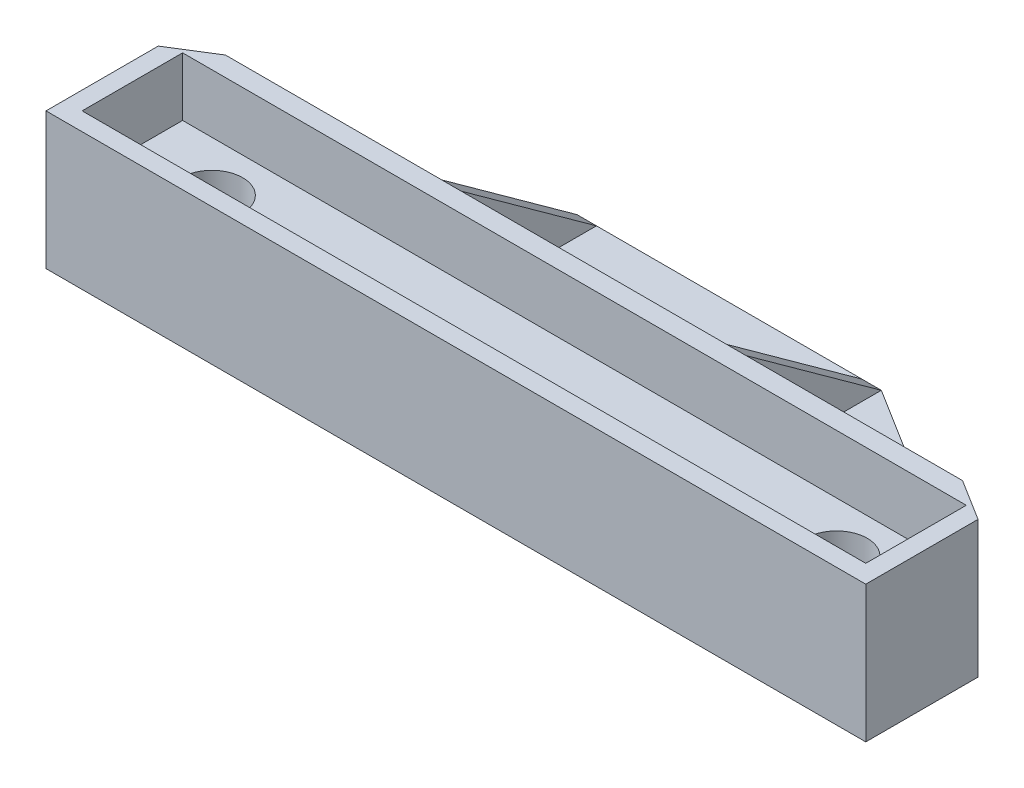
ISO-10303-21;
HEADER;
FILE_DESCRIPTION(('STEP AP214'),'2;1');
FILE_NAME('part.step','',(''),(''),'','','');
FILE_SCHEMA(('AUTOMOTIVE_DESIGN { 1 0 10303 214 1 1 1 1 }'));
ENDSEC;
DATA;
#1=APPLICATION_CONTEXT('core data for automotive mechanical design processes');
#2=APPLICATION_PROTOCOL_DEFINITION('international standard','automotive_design',2000,#1);
#3=PRODUCT_CONTEXT('',#1,'mechanical');
#4=PRODUCT('Part','Part','',(#3));
#5=PRODUCT_RELATED_PRODUCT_CATEGORY('part','',(#4));
#6=PRODUCT_DEFINITION_FORMATION('','',#4);
#7=PRODUCT_DEFINITION_CONTEXT('part definition',#1,'design');
#8=PRODUCT_DEFINITION('design','',#6,#7);
#9=PRODUCT_DEFINITION_SHAPE('','',#8);
#10=(LENGTH_UNIT() NAMED_UNIT(*) SI_UNIT(.MILLI.,.METRE.));
#11=(NAMED_UNIT(*) PLANE_ANGLE_UNIT() SI_UNIT($,.RADIAN.));
#12=(NAMED_UNIT(*) SI_UNIT($,.STERADIAN.) SOLID_ANGLE_UNIT());
#13=UNCERTAINTY_MEASURE_WITH_UNIT(LENGTH_MEASURE(1.E-05),#10,'distance_accuracy_value','');
#14=(GEOMETRIC_REPRESENTATION_CONTEXT(3) GLOBAL_UNCERTAINTY_ASSIGNED_CONTEXT((#13)) GLOBAL_UNIT_ASSIGNED_CONTEXT((#10,
#11,#12)) REPRESENTATION_CONTEXT('',''));
#15=CARTESIAN_POINT('',(0.,0.,0.));
#16=DIRECTION('',(0.,0.,1.));
#17=DIRECTION('',(1.,0.,0.));
#18=AXIS2_PLACEMENT_3D('',#15,#16,#17);
#19=CARTESIAN_POINT('',(-16.,7.,-3.49999999993634));
#20=DIRECTION('',(0.,-1.,0.));
#21=DIRECTION('',(0.,0.,-1.));
#22=AXIS2_PLACEMENT_3D('',#19,#20,#21);
#23=CYLINDRICAL_SURFACE('',#22,1.575);
#24=CARTESIAN_POINT('',(-16.,0.,-3.49999999993634));
#25=DIRECTION('',(0.,-1.,0.));
#26=DIRECTION('',(0.,0.,1.));
#27=AXIS2_PLACEMENT_3D('',#24,#25,#26);
#28=CIRCLE('',#27,1.575);
#29=CARTESIAN_POINT('',(-16.,0.,-1.92499999993634));
#30=VERTEX_POINT('',#29);
#31=EDGE_CURVE('E268',#30,#30,#28,.T.);
#32=ORIENTED_EDGE('',*,*,#31,.T.);
#33=EDGE_LOOP('',(#32));
#34=FACE_BOUND('',#33,.T.);
#35=CARTESIAN_POINT('',(-16.,4.,-3.49999999993634));
#36=DIRECTION('',(0.,1.,0.));
#37=DIRECTION('',(0.,0.,1.));
#38=AXIS2_PLACEMENT_3D('',#35,#36,#37);
#39=CIRCLE('',#38,1.575);
#40=CARTESIAN_POINT('',(-16.,4.,-1.92499999993634));
#41=VERTEX_POINT('',#40);
#42=EDGE_CURVE('E265',#41,#41,#39,.F.);
#43=ORIENTED_EDGE('',*,*,#42,.F.);
#44=EDGE_LOOP('',(#43));
#45=FACE_BOUND('',#44,.T.);
#46=ADVANCED_FACE('F40',(#34,#45),#23,.F.);
#47=CARTESIAN_POINT('',(16.,7.,-3.49999999993633));
#48=DIRECTION('',(0.,-1.,0.));
#49=DIRECTION('',(0.,0.,-1.));
#50=AXIS2_PLACEMENT_3D('',#47,#48,#49);
#51=CYLINDRICAL_SURFACE('',#50,1.575);
#52=CARTESIAN_POINT('',(16.,0.,-3.49999999993633));
#53=DIRECTION('',(0.,-1.,0.));
#54=DIRECTION('',(0.,0.,-1.));
#55=AXIS2_PLACEMENT_3D('',#52,#53,#54);
#56=CIRCLE('',#55,1.575);
#57=CARTESIAN_POINT('',(16.,0.,-5.07499999993633));
#58=VERTEX_POINT('',#57);
#59=EDGE_CURVE('E269',#58,#58,#56,.T.);
#60=ORIENTED_EDGE('',*,*,#59,.T.);
#61=EDGE_LOOP('',(#60));
#62=FACE_BOUND('',#61,.T.);
#63=CARTESIAN_POINT('',(16.,4.,-3.49999999993633));
#64=DIRECTION('',(0.,1.,0.));
#65=DIRECTION('',(0.,0.,1.));
#66=AXIS2_PLACEMENT_3D('',#63,#64,#65);
#67=CIRCLE('',#66,1.575);
#68=CARTESIAN_POINT('',(16.,4.,-1.92499999993633));
#69=VERTEX_POINT('',#68);
#70=EDGE_CURVE('E258',#69,#69,#67,.F.);
#71=ORIENTED_EDGE('',*,*,#70,.F.);
#72=EDGE_LOOP('',(#71));
#73=FACE_BOUND('',#72,.T.);
#74=ADVANCED_FACE('F349',(#62,#73),#51,.F.);
#75=CARTESIAN_POINT('',(21.,7.,-5.75));
#76=DIRECTION('',(-1.,0.,0.));
#77=DIRECTION('',(0.,0.,1.));
#78=AXIS2_PLACEMENT_3D('',#75,#76,#77);
#79=PLANE('',#78);
#80=DIRECTION('',(0.,0.,-1.));
#81=VECTOR('',#80,1.);
#82=CARTESIAN_POINT('',(21.,0.,-5.75));
#83=LINE('',#82,#81);
#84=CARTESIAN_POINT('',(21.,0.,0.));
#85=VERTEX_POINT('',#84);
#86=CARTESIAN_POINT('',(21.,0.,-5.75));
#87=VERTEX_POINT('',#86);
#88=EDGE_CURVE('E272',#85,#87,#83,.T.);
#89=ORIENTED_EDGE('',*,*,#88,.T.);
#90=DIRECTION('',(0.,-1.,0.));
#91=VECTOR('',#90,1.);
#92=CARTESIAN_POINT('',(21.,7.,-5.75));
#93=LINE('',#92,#91);
#94=CARTESIAN_POINT('',(21.,7.,-5.75));
#95=VERTEX_POINT('',#94);
#96=EDGE_CURVE('E305',#95,#87,#93,.T.);
#97=ORIENTED_EDGE('',*,*,#96,.F.);
#98=DIRECTION('',(0.,0.,-1.));
#99=VECTOR('',#98,1.);
#100=CARTESIAN_POINT('',(21.,7.,-5.75));
#101=LINE('',#100,#99);
#102=CARTESIAN_POINT('',(21.,7.,0.));
#103=VERTEX_POINT('',#102);
#104=EDGE_CURVE('E275',#103,#95,#101,.T.);
#105=ORIENTED_EDGE('',*,*,#104,.F.);
#106=DIRECTION('',(0.,-1.,0.));
#107=VECTOR('',#106,1.);
#108=CARTESIAN_POINT('',(21.,7.,0.));
#109=LINE('',#108,#107);
#110=EDGE_CURVE('E288',#103,#85,#109,.T.);
#111=ORIENTED_EDGE('',*,*,#110,.T.);
#112=EDGE_LOOP('',(#89,#97,#105,#111));
#113=FACE_BOUND('',#112,.T.);
#114=ADVANCED_FACE('F355',(#113),#79,.F.);
#115=CARTESIAN_POINT('',(21.,7.,-5.75));
#116=DIRECTION('',(-0.529919264233528,0.,0.848048096156224));
#117=DIRECTION('',(0.848048096156224,0.,0.529919264233528));
#118=AXIS2_PLACEMENT_3D('',#115,#116,#117);
#119=PLANE('',#118);
#120=DIRECTION('',(-0.848048096156395,0.,-0.529919264233254));
#121=VECTOR('',#120,1.);
#122=CARTESIAN_POINT('',(7.79724013561682,2.,-13.9999999998727));
#123=LINE('',#122,#121);
#124=CARTESIAN_POINT('',(17.2792222201838,2.,-8.07499999987266));
#125=VERTEX_POINT('',#124);
#126=CARTESIAN_POINT('',(7.79724013561682,2.,-13.9999999998727));
#127=VERTEX_POINT('',#126);
#128=EDGE_CURVE('E178',#125,#127,#123,.T.);
#129=ORIENTED_EDGE('',*,*,#128,.F.);
#130=DIRECTION('',(-0.749337346632538,-0.468237942152119,-0.468237942152125));
#131=VECTOR('',#130,1.);
#132=CARTESIAN_POINT('',(21.9385723739609,4.91148511091008,-5.16351488896254));
#133=LINE('',#132,#131);
#134=CARTESIAN_POINT('',(18.8795567492247,2.99999999999999,-7.07499999987266));
#135=VERTEX_POINT('',#134);
#136=EDGE_CURVE('E49',#125,#135,#133,.F.);
#137=ORIENTED_EDGE('',*,*,#136,.T.);
#138=DIRECTION('',(0.,1.,0.));
#139=VECTOR('',#138,1.);
#140=CARTESIAN_POINT('',(18.8795567492247,2.,-7.07499999987266));
#141=LINE('',#140,#139);
#142=CARTESIAN_POINT('',(18.8795567492247,7.,-7.07499999987266));
#143=VERTEX_POINT('',#142);
#144=EDGE_CURVE('E222',#135,#143,#141,.T.);
#145=ORIENTED_EDGE('',*,*,#144,.T.);
#146=DIRECTION('',(-0.848048096156224,0.,-0.529919264233528));
#147=VECTOR('',#146,1.);
#148=CARTESIAN_POINT('',(21.,7.,-5.75));
#149=LINE('',#148,#147);
#150=EDGE_CURVE('E278',#95,#143,#149,.T.);
#151=ORIENTED_EDGE('',*,*,#150,.F.);
#152=ORIENTED_EDGE('',*,*,#96,.T.);
#153=DIRECTION('',(-0.848048096156224,0.,-0.529919264233528));
#154=VECTOR('',#153,1.);
#155=CARTESIAN_POINT('',(21.,0.,-5.75));
#156=LINE('',#155,#154);
#157=CARTESIAN_POINT('',(7.79724013561683,0.,-13.9999999998727));
#158=VERTEX_POINT('',#157);
#159=EDGE_CURVE('E226',#87,#158,#156,.T.);
#160=ORIENTED_EDGE('',*,*,#159,.T.);
#161=DIRECTION('',(0.,-1.,0.));
#162=VECTOR('',#161,1.);
#163=CARTESIAN_POINT('',(7.79724013561683,7.,-13.9999999998727));
#164=LINE('',#163,#162);
#165=EDGE_CURVE('E211',#127,#158,#164,.T.);
#166=ORIENTED_EDGE('',*,*,#165,.F.);
#167=EDGE_LOOP('',(#129,#137,#145,#151,#152,#160,#166));
#168=FACE_BOUND('',#167,.T.);
#169=ADVANCED_FACE('F224',(#168),#119,.F.);
#170=CARTESIAN_POINT('',(-21.,7.,-5.75));
#171=DIRECTION('',(0.529919264233528,0.,0.848048096156224));
#172=DIRECTION('',(0.848048096156224,0.,-0.529919264233528));
#173=AXIS2_PLACEMENT_3D('',#170,#171,#172);
#174=PLANE('',#173);
#175=DIRECTION('',(-0.848048096156224,0.,0.529919264233528));
#176=VECTOR('',#175,1.);
#177=CARTESIAN_POINT('',(-21.,7.,-5.75));
#178=LINE('',#177,#176);
#179=CARTESIAN_POINT('',(-18.8795567492247,7.,-7.07499999987266));
#180=VERTEX_POINT('',#179);
#181=CARTESIAN_POINT('',(-21.,7.,-5.75));
#182=VERTEX_POINT('',#181);
#183=EDGE_CURVE('E282',#180,#182,#178,.T.);
#184=ORIENTED_EDGE('',*,*,#183,.F.);
#185=DIRECTION('',(0.,1.,0.));
#186=VECTOR('',#185,1.);
#187=CARTESIAN_POINT('',(-18.8795567492247,2.,-7.07499999987266));
#188=LINE('',#187,#186);
#189=CARTESIAN_POINT('',(-18.8795567492247,2.99999999999999,-7.07499999987266));
#190=VERTEX_POINT('',#189);
#191=EDGE_CURVE('E425',#190,#180,#188,.T.);
#192=ORIENTED_EDGE('',*,*,#191,.F.);
#193=DIRECTION('',(-0.749337346632538,0.468237942152119,0.468237942152125));
#194=VECTOR('',#193,1.);
#195=CARTESIAN_POINT('',(-21.9385723739609,4.91148511091008,-5.16351488896254));
#196=LINE('',#195,#194);
#197=CARTESIAN_POINT('',(-17.2792222201838,2.,-8.07499999987266));
#198=VERTEX_POINT('',#197);
#199=EDGE_CURVE('E11',#190,#198,#196,.F.);
#200=ORIENTED_EDGE('',*,*,#199,.T.);
#201=DIRECTION('',(-0.848048096156395,0.,0.529919264233254));
#202=VECTOR('',#201,1.);
#203=CARTESIAN_POINT('',(-7.79724013561682,2.,-13.9999999998727));
#204=LINE('',#203,#202);
#205=CARTESIAN_POINT('',(-7.79724013561682,2.,-13.9999999998727));
#206=VERTEX_POINT('',#205);
#207=EDGE_CURVE('E420',#206,#198,#204,.T.);
#208=ORIENTED_EDGE('',*,*,#207,.F.);
#209=DIRECTION('',(0.,-1.,0.));
#210=VECTOR('',#209,1.);
#211=CARTESIAN_POINT('',(-7.79724013561683,7.,-13.9999999998727));
#212=LINE('',#211,#210);
#213=CARTESIAN_POINT('',(-7.79724013561683,0.,-13.9999999998727));
#214=VERTEX_POINT('',#213);
#215=EDGE_CURVE('E229',#206,#214,#212,.T.);
#216=ORIENTED_EDGE('',*,*,#215,.T.);
#217=DIRECTION('',(-0.848048096156224,0.,0.529919264233528));
#218=VECTOR('',#217,1.);
#219=CARTESIAN_POINT('',(-21.,0.,-5.75));
#220=LINE('',#219,#218);
#221=CARTESIAN_POINT('',(-21.,0.,-5.75));
#222=VERTEX_POINT('',#221);
#223=EDGE_CURVE('E292',#214,#222,#220,.T.);
#224=ORIENTED_EDGE('',*,*,#223,.T.);
#225=DIRECTION('',(0.,-1.,0.));
#226=VECTOR('',#225,1.);
#227=CARTESIAN_POINT('',(-21.,7.,-5.75));
#228=LINE('',#227,#226);
#229=EDGE_CURVE('E302',#182,#222,#228,.T.);
#230=ORIENTED_EDGE('',*,*,#229,.F.);
#231=EDGE_LOOP('',(#184,#192,#200,#208,#216,#224,#230));
#232=FACE_BOUND('',#231,.T.);
#233=ADVANCED_FACE('F377',(#232),#174,.F.);
#234=CARTESIAN_POINT('',(-21.,7.,-5.75));
#235=DIRECTION('',(1.,0.,0.));
#236=DIRECTION('',(0.,0.,-1.));
#237=AXIS2_PLACEMENT_3D('',#234,#235,#236);
#238=PLANE('',#237);
#239=DIRECTION('',(0.,0.,1.));
#240=VECTOR('',#239,1.);
#241=CARTESIAN_POINT('',(-21.,0.,-5.75));
#242=LINE('',#241,#240);
#243=CARTESIAN_POINT('',(-21.,0.,0.));
#244=VERTEX_POINT('',#243);
#245=EDGE_CURVE('E294',#222,#244,#242,.T.);
#246=ORIENTED_EDGE('',*,*,#245,.T.);
#247=DIRECTION('',(0.,-1.,0.));
#248=VECTOR('',#247,1.);
#249=CARTESIAN_POINT('',(-21.,7.,0.));
#250=LINE('',#249,#248);
#251=CARTESIAN_POINT('',(-21.,7.,0.));
#252=VERTEX_POINT('',#251);
#253=EDGE_CURVE('E299',#252,#244,#250,.T.);
#254=ORIENTED_EDGE('',*,*,#253,.F.);
#255=DIRECTION('',(0.,0.,1.));
#256=VECTOR('',#255,1.);
#257=CARTESIAN_POINT('',(-21.,7.,-5.75));
#258=LINE('',#257,#256);
#259=EDGE_CURVE('E284',#182,#252,#258,.T.);
#260=ORIENTED_EDGE('',*,*,#259,.F.);
#261=ORIENTED_EDGE('',*,*,#229,.T.);
#262=EDGE_LOOP('',(#246,#254,#260,#261));
#263=FACE_BOUND('',#262,.T.);
#264=ADVANCED_FACE('F373',(#263),#238,.F.);
#265=CARTESIAN_POINT('',(-21.,7.,0.));
#266=DIRECTION('',(0.,0.,-1.));
#267=DIRECTION('',(-1.,0.,0.));
#268=AXIS2_PLACEMENT_3D('',#265,#266,#267);
#269=PLANE('',#268);
#270=DIRECTION('',(1.,0.,0.));
#271=VECTOR('',#270,1.);
#272=CARTESIAN_POINT('',(-21.,0.,0.));
#273=LINE('',#272,#271);
#274=EDGE_CURVE('E279',#244,#85,#273,.T.);
#275=ORIENTED_EDGE('',*,*,#274,.T.);
#276=ORIENTED_EDGE('',*,*,#110,.F.);
#277=DIRECTION('',(1.,0.,0.));
#278=VECTOR('',#277,1.);
#279=CARTESIAN_POINT('',(-21.,7.,0.));
#280=LINE('',#279,#278);
#281=EDGE_CURVE('E286',#252,#103,#280,.T.);
#282=ORIENTED_EDGE('',*,*,#281,.F.);
#283=ORIENTED_EDGE('',*,*,#253,.T.);
#284=EDGE_LOOP('',(#275,#276,#282,#283));
#285=FACE_BOUND('',#284,.T.);
#286=ADVANCED_FACE('F365',(#285),#269,.F.);
#287=CARTESIAN_POINT('',(0.,7.,0.));
#288=DIRECTION('',(0.,1.,0.));
#289=DIRECTION('',(0.,0.,1.));
#290=AXIS2_PLACEMENT_3D('',#287,#288,#289);
#291=PLANE('',#290);
#292=DIRECTION('',(-1.,0.,0.));
#293=VECTOR('',#292,1.);
#294=CARTESIAN_POINT('',(21.,7.,-7.07499999987266));
#295=LINE('',#294,#293);
#296=CARTESIAN_POINT('',(-6.79724013561682,7.,-7.07499999987266));
#297=VERTEX_POINT('',#296);
#298=CARTESIAN_POINT('',(-7.79724013561682,7.,-7.07499999987266));
#299=VERTEX_POINT('',#298);
#300=EDGE_CURVE('E216',#297,#299,#295,.T.);
#301=ORIENTED_EDGE('',*,*,#300,.T.);
#302=DIRECTION('',(1.,0.,0.));
#303=VECTOR('',#302,1.);
#304=CARTESIAN_POINT('',(-18.8795567492247,7.,-7.07499999987266));
#305=LINE('',#304,#303);
#306=EDGE_CURVE('E411',#180,#299,#305,.T.);
#307=ORIENTED_EDGE('',*,*,#306,.F.);
#308=ORIENTED_EDGE('',*,*,#183,.T.);
#309=ORIENTED_EDGE('',*,*,#259,.T.);
#310=ORIENTED_EDGE('',*,*,#281,.T.);
#311=ORIENTED_EDGE('',*,*,#104,.T.);
#312=ORIENTED_EDGE('',*,*,#150,.T.);
#313=DIRECTION('',(1.,0.,0.));
#314=VECTOR('',#313,1.);
#315=CARTESIAN_POINT('',(18.8795567492247,7.,-7.07499999987266));
#316=LINE('',#315,#314);
#317=CARTESIAN_POINT('',(7.79724013561682,7.,-7.07499999987266));
#318=VERTEX_POINT('',#317);
#319=EDGE_CURVE('E187',#318,#143,#316,.T.);
#320=ORIENTED_EDGE('',*,*,#319,.F.);
#321=CARTESIAN_POINT('',(6.79724013561682,7.,-7.07499999987266));
#322=VERTEX_POINT('',#321);
#323=EDGE_CURVE('E200',#318,#322,#295,.T.);
#324=ORIENTED_EDGE('',*,*,#323,.T.);
#325=DIRECTION('',(1.,0.,0.));
#326=VECTOR('',#325,1.);
#327=CARTESIAN_POINT('',(6.79724013561682,7.,-7.07499999987266));
#328=LINE('',#327,#326);
#329=EDGE_CURVE('E407',#297,#322,#328,.T.);
#330=ORIENTED_EDGE('',*,*,#329,.F.);
#331=EDGE_LOOP('',(#301,#307,#308,#309,#310,#311,#312,#320,#324,#330));
#332=FACE_BOUND('',#331,.T.);
#333=DIRECTION('',(0.,0.,1.));
#334=VECTOR('',#333,1.);
#335=CARTESIAN_POINT('',(-20.075,7.,-6.07499999987266));
#336=LINE('',#335,#334);
#337=CARTESIAN_POINT('',(-20.075,7.,-6.07499999987266));
#338=VERTEX_POINT('',#337);
#339=CARTESIAN_POINT('',(-20.075,7.,-0.924999999872669));
#340=VERTEX_POINT('',#339);
#341=EDGE_CURVE('E228',#338,#340,#336,.T.);
#342=ORIENTED_EDGE('',*,*,#341,.F.);
#343=DIRECTION('',(1.,0.,0.));
#344=VECTOR('',#343,1.);
#345=CARTESIAN_POINT('',(-20.075,7.,-6.07499999987266));
#346=LINE('',#345,#344);
#347=CARTESIAN_POINT('',(20.075,7.,-6.07499999987266));
#348=VERTEX_POINT('',#347);
#349=EDGE_CURVE('E241',#338,#348,#346,.T.);
#350=ORIENTED_EDGE('',*,*,#349,.T.);
#351=DIRECTION('',(0.,0.,1.));
#352=VECTOR('',#351,1.);
#353=CARTESIAN_POINT('',(20.075,7.,-6.07499999987266));
#354=LINE('',#353,#352);
#355=CARTESIAN_POINT('',(20.075,7.,-0.924999999872669));
#356=VERTEX_POINT('',#355);
#357=EDGE_CURVE('E251',#348,#356,#354,.T.);
#358=ORIENTED_EDGE('',*,*,#357,.T.);
#359=DIRECTION('',(1.,0.,0.));
#360=VECTOR('',#359,1.);
#361=CARTESIAN_POINT('',(-20.075,7.,-0.924999999872669));
#362=LINE('',#361,#360);
#363=EDGE_CURVE('E231',#340,#356,#362,.T.);
#364=ORIENTED_EDGE('',*,*,#363,.F.);
#365=EDGE_LOOP('',(#342,#350,#358,#364));
#366=FACE_BOUND('',#365,.T.);
#367=ADVANCED_FACE('F361',(#332,#366),#291,.T.);
#368=CARTESIAN_POINT('',(0.,0.,0.));
#369=DIRECTION('',(0.,1.,0.));
#370=DIRECTION('',(0.,0.,1.));
#371=AXIS2_PLACEMENT_3D('',#368,#369,#370);
#372=PLANE('',#371);
#373=ORIENTED_EDGE('',*,*,#59,.F.);
#374=EDGE_LOOP('',(#373));
#375=FACE_BOUND('',#374,.T.);
#376=ORIENTED_EDGE('',*,*,#31,.F.);
#377=EDGE_LOOP('',(#376));
#378=FACE_BOUND('',#377,.T.);
#379=ORIENTED_EDGE('',*,*,#88,.F.);
#380=ORIENTED_EDGE('',*,*,#274,.F.);
#381=ORIENTED_EDGE('',*,*,#245,.F.);
#382=ORIENTED_EDGE('',*,*,#223,.F.);
#383=DIRECTION('',(-1.,0.,0.));
#384=VECTOR('',#383,1.);
#385=CARTESIAN_POINT('',(7.79724013561683,0.,-13.9999999998727));
#386=LINE('',#385,#384);
#387=EDGE_CURVE('E233',#158,#214,#386,.T.);
#388=ORIENTED_EDGE('',*,*,#387,.F.);
#389=ORIENTED_EDGE('',*,*,#159,.F.);
#390=EDGE_LOOP('',(#379,#380,#381,#382,#388,#389));
#391=FACE_BOUND('',#390,.T.);
#392=ADVANCED_FACE('F364',(#375,#378,#391),#372,.F.);
#393=CARTESIAN_POINT('',(0.,4.,0.));
#394=DIRECTION('',(0.,1.,0.));
#395=DIRECTION('',(0.,0.,1.));
#396=AXIS2_PLACEMENT_3D('',#393,#394,#395);
#397=PLANE('',#396);
#398=DIRECTION('',(0.,0.,1.));
#399=VECTOR('',#398,1.);
#400=CARTESIAN_POINT('',(-20.075,4.,-6.07499999987266));
#401=LINE('',#400,#399);
#402=CARTESIAN_POINT('',(-20.075,4.,-6.07499999987266));
#403=VERTEX_POINT('',#402);
#404=CARTESIAN_POINT('',(-20.075,4.,-0.924999999872669));
#405=VERTEX_POINT('',#404);
#406=EDGE_CURVE('E237',#403,#405,#401,.T.);
#407=ORIENTED_EDGE('',*,*,#406,.T.);
#408=DIRECTION('',(1.,0.,0.));
#409=VECTOR('',#408,1.);
#410=CARTESIAN_POINT('',(-20.075,4.,-0.924999999872669));
#411=LINE('',#410,#409);
#412=CARTESIAN_POINT('',(20.075,4.,-0.924999999872669));
#413=VERTEX_POINT('',#412);
#414=EDGE_CURVE('E240',#405,#413,#411,.T.);
#415=ORIENTED_EDGE('',*,*,#414,.T.);
#416=DIRECTION('',(0.,0.,1.));
#417=VECTOR('',#416,1.);
#418=CARTESIAN_POINT('',(20.075,4.,-6.07499999987266));
#419=LINE('',#418,#417);
#420=CARTESIAN_POINT('',(20.075,4.,-6.07499999987266));
#421=VERTEX_POINT('',#420);
#422=EDGE_CURVE('E244',#421,#413,#419,.T.);
#423=ORIENTED_EDGE('',*,*,#422,.F.);
#424=DIRECTION('',(1.,0.,0.));
#425=VECTOR('',#424,1.);
#426=CARTESIAN_POINT('',(-20.075,4.,-6.07499999987266));
#427=LINE('',#426,#425);
#428=EDGE_CURVE('E246',#403,#421,#427,.T.);
#429=ORIENTED_EDGE('',*,*,#428,.F.);
#430=EDGE_LOOP('',(#407,#415,#423,#429));
#431=FACE_BOUND('',#430,.T.);
#432=ORIENTED_EDGE('',*,*,#70,.T.);
#433=EDGE_LOOP('',(#432));
#434=FACE_BOUND('',#433,.T.);
#435=ORIENTED_EDGE('',*,*,#42,.T.);
#436=EDGE_LOOP('',(#435));
#437=FACE_BOUND('',#436,.T.);
#438=ADVANCED_FACE('F369',(#431,#434,#437),#397,.T.);
#439=CARTESIAN_POINT('',(-20.075,4.,-6.07499999987266));
#440=DIRECTION('',(-1.,0.,0.));
#441=DIRECTION('',(0.,0.,1.));
#442=AXIS2_PLACEMENT_3D('',#439,#440,#441);
#443=PLANE('',#442);
#444=ORIENTED_EDGE('',*,*,#341,.T.);
#445=DIRECTION('',(0.,1.,0.));
#446=VECTOR('',#445,1.);
#447=CARTESIAN_POINT('',(-20.075,4.,-0.924999999872669));
#448=LINE('',#447,#446);
#449=EDGE_CURVE('E247',#405,#340,#448,.T.);
#450=ORIENTED_EDGE('',*,*,#449,.F.);
#451=ORIENTED_EDGE('',*,*,#406,.F.);
#452=DIRECTION('',(0.,1.,0.));
#453=VECTOR('',#452,1.);
#454=CARTESIAN_POINT('',(-20.075,4.,-6.07499999987266));
#455=LINE('',#454,#453);
#456=EDGE_CURVE('E256',#403,#338,#455,.T.);
#457=ORIENTED_EDGE('',*,*,#456,.T.);
#458=EDGE_LOOP('',(#444,#450,#451,#457));
#459=FACE_BOUND('',#458,.T.);
#460=ADVANCED_FACE('F645',(#459),#443,.F.);
#461=CARTESIAN_POINT('',(-20.075,4.,-6.07499999987266));
#462=DIRECTION('',(0.,0.,1.));
#463=DIRECTION('',(1.,0.,0.));
#464=AXIS2_PLACEMENT_3D('',#461,#462,#463);
#465=PLANE('',#464);
#466=ORIENTED_EDGE('',*,*,#349,.F.);
#467=ORIENTED_EDGE('',*,*,#456,.F.);
#468=ORIENTED_EDGE('',*,*,#428,.T.);
#469=DIRECTION('',(0.,1.,0.));
#470=VECTOR('',#469,1.);
#471=CARTESIAN_POINT('',(20.075,4.,-6.07499999987266));
#472=LINE('',#471,#470);
#473=EDGE_CURVE('E259',#421,#348,#472,.T.);
#474=ORIENTED_EDGE('',*,*,#473,.T.);
#475=EDGE_LOOP('',(#466,#467,#468,#474));
#476=FACE_BOUND('',#475,.T.);
#477=ADVANCED_FACE('F634',(#476),#465,.T.);
#478=CARTESIAN_POINT('',(20.075,4.,-6.07499999987266));
#479=DIRECTION('',(-1.,0.,0.));
#480=DIRECTION('',(0.,0.,1.));
#481=AXIS2_PLACEMENT_3D('',#478,#479,#480);
#482=PLANE('',#481);
#483=ORIENTED_EDGE('',*,*,#357,.F.);
#484=ORIENTED_EDGE('',*,*,#473,.F.);
#485=ORIENTED_EDGE('',*,*,#422,.T.);
#486=DIRECTION('',(0.,1.,0.));
#487=VECTOR('',#486,1.);
#488=CARTESIAN_POINT('',(20.075,4.,-0.924999999872669));
#489=LINE('',#488,#487);
#490=EDGE_CURVE('E261',#413,#356,#489,.T.);
#491=ORIENTED_EDGE('',*,*,#490,.T.);
#492=EDGE_LOOP('',(#483,#484,#485,#491));
#493=FACE_BOUND('',#492,.T.);
#494=ADVANCED_FACE('F623',(#493),#482,.T.);
#495=CARTESIAN_POINT('',(-20.075,4.,-0.924999999872669));
#496=DIRECTION('',(0.,0.,1.));
#497=DIRECTION('',(1.,0.,0.));
#498=AXIS2_PLACEMENT_3D('',#495,#496,#497);
#499=PLANE('',#498);
#500=ORIENTED_EDGE('',*,*,#363,.T.);
#501=ORIENTED_EDGE('',*,*,#490,.F.);
#502=ORIENTED_EDGE('',*,*,#414,.F.);
#503=ORIENTED_EDGE('',*,*,#449,.T.);
#504=EDGE_LOOP('',(#500,#501,#502,#503));
#505=FACE_BOUND('',#504,.T.);
#506=ADVANCED_FACE('F600',(#505),#499,.F.);
#507=CARTESIAN_POINT('',(7.79724013561683,7.,-13.9999999998727));
#508=DIRECTION('',(0.,0.,1.));
#509=DIRECTION('',(1.,0.,0.));
#510=AXIS2_PLACEMENT_3D('',#507,#508,#509);
#511=PLANE('',#510);
#512=ORIENTED_EDGE('',*,*,#215,.F.);
#513=DIRECTION('',(-1.,0.,0.));
#514=VECTOR('',#513,1.);
#515=CARTESIAN_POINT('',(21.,2.,-13.9999999998727));
#516=LINE('',#515,#514);
#517=CARTESIAN_POINT('',(-6.79724013561682,2.,-13.9999999998727));
#518=VERTEX_POINT('',#517);
#519=EDGE_CURVE('E217',#518,#206,#516,.T.);
#520=ORIENTED_EDGE('',*,*,#519,.F.);
#521=DIRECTION('',(-1.,0.,0.));
#522=VECTOR('',#521,1.);
#523=CARTESIAN_POINT('',(-6.79724013561682,2.,-13.9999999998727));
#524=LINE('',#523,#522);
#525=CARTESIAN_POINT('',(6.79724013561682,2.,-13.9999999998727));
#526=VERTEX_POINT('',#525);
#527=EDGE_CURVE('E215',#526,#518,#524,.T.);
#528=ORIENTED_EDGE('',*,*,#527,.F.);
#529=EDGE_CURVE('E197',#127,#526,#516,.T.);
#530=ORIENTED_EDGE('',*,*,#529,.F.);
#531=ORIENTED_EDGE('',*,*,#165,.T.);
#532=ORIENTED_EDGE('',*,*,#387,.T.);
#533=EDGE_LOOP('',(#512,#520,#528,#530,#531,#532));
#534=FACE_BOUND('',#533,.T.);
#535=ADVANCED_FACE('F209',(#534),#511,.F.);
#536=CARTESIAN_POINT('',(6.79724013561682,2.,-7.07499999987266));
#537=DIRECTION('',(0.,0.,1.));
#538=DIRECTION('',(1.,0.,0.));
#539=AXIS2_PLACEMENT_3D('',#536,#537,#538);
#540=PLANE('',#539);
#541=DIRECTION('',(0.,1.,0.));
#542=VECTOR('',#541,1.);
#543=CARTESIAN_POINT('',(6.79724013561682,2.,-7.07499999987266));
#544=LINE('',#543,#542);
#545=CARTESIAN_POINT('',(6.79724013561682,2.99999999999999,-7.07499999987266));
#546=VERTEX_POINT('',#545);
#547=EDGE_CURVE('E402',#546,#322,#544,.T.);
#548=ORIENTED_EDGE('',*,*,#547,.F.);
#549=DIRECTION('',(-1.,0.,0.));
#550=VECTOR('',#549,1.);
#551=CARTESIAN_POINT('',(-6.79724013561682,2.99999999999999,-7.07499999987266));
#552=LINE('',#551,#550);
#553=CARTESIAN_POINT('',(-6.79724013561682,2.99999999999999,-7.07499999987266));
#554=VERTEX_POINT('',#553);
#555=EDGE_CURVE('E56',#546,#554,#552,.T.);
#556=ORIENTED_EDGE('',*,*,#555,.T.);
#557=DIRECTION('',(0.,1.,0.));
#558=VECTOR('',#557,1.);
#559=CARTESIAN_POINT('',(-6.79724013561682,2.,-7.07499999987266));
#560=LINE('',#559,#558);
#561=EDGE_CURVE('E401',#554,#297,#560,.T.);
#562=ORIENTED_EDGE('',*,*,#561,.T.);
#563=ORIENTED_EDGE('',*,*,#329,.T.);
#564=EDGE_LOOP('',(#548,#556,#562,#563));
#565=FACE_BOUND('',#564,.T.);
#566=ADVANCED_FACE('F440',(#565),#540,.F.);
#567=CARTESIAN_POINT('',(-6.79724013561682,2.,-7.07499999987266));
#568=DIRECTION('',(-1.,0.,0.));
#569=DIRECTION('',(0.,0.,1.));
#570=AXIS2_PLACEMENT_3D('',#567,#568,#569);
#571=PLANE('',#570);
#572=ORIENTED_EDGE('',*,*,#561,.F.);
#573=DIRECTION('',(0.,0.707106781186543,0.707106781186552));
#574=VECTOR('',#573,1.);
#575=CARTESIAN_POINT('',(-6.79724013561682,2.,-8.07499999987266));
#576=LINE('',#575,#574);
#577=CARTESIAN_POINT('',(-6.79724013561682,2.,-8.07499999987266));
#578=VERTEX_POINT('',#577);
#579=EDGE_CURVE('E325',#554,#578,#576,.F.);
#580=ORIENTED_EDGE('',*,*,#579,.T.);
#581=DIRECTION('',(0.,0.,1.));
#582=VECTOR('',#581,1.);
#583=CARTESIAN_POINT('',(-6.79724013561682,2.,-7.07499999987266));
#584=LINE('',#583,#582);
#585=EDGE_CURVE('E405',#518,#578,#584,.T.);
#586=ORIENTED_EDGE('',*,*,#585,.F.);
#587=DIRECTION('',(0.,0.585383683581828,0.810756401760831));
#588=VECTOR('',#587,1.);
#589=CARTESIAN_POINT('',(-6.79724013561682,5.28662971498086,-9.44801784462418));
#590=LINE('',#589,#588);
#591=EDGE_CURVE('E418',#518,#297,#590,.T.);
#592=ORIENTED_EDGE('',*,*,#591,.T.);
#593=EDGE_LOOP('',(#572,#580,#586,#592));
#594=FACE_BOUND('',#593,.T.);
#595=ADVANCED_FACE('F445',(#594),#571,.F.);
#596=CARTESIAN_POINT('',(6.79724013561682,2.,-13.9999999998727));
#597=DIRECTION('',(1.,0.,0.));
#598=DIRECTION('',(0.,0.,-1.));
#599=AXIS2_PLACEMENT_3D('',#596,#597,#598);
#600=PLANE('',#599);
#601=DIRECTION('',(0.,0.,-1.));
#602=VECTOR('',#601,1.);
#603=CARTESIAN_POINT('',(6.79724013561682,2.,-13.9999999998727));
#604=LINE('',#603,#602);
#605=CARTESIAN_POINT('',(6.79724013561682,2.,-8.07499999987266));
#606=VERTEX_POINT('',#605);
#607=EDGE_CURVE('E410',#606,#526,#604,.T.);
#608=ORIENTED_EDGE('',*,*,#607,.F.);
#609=DIRECTION('',(0.,-0.707106781186543,-0.707106781186552));
#610=VECTOR('',#609,1.);
#611=CARTESIAN_POINT('',(6.79724013561682,2.,-8.07499999987266));
#612=LINE('',#611,#610);
#613=EDGE_CURVE('E64',#606,#546,#612,.F.);
#614=ORIENTED_EDGE('',*,*,#613,.T.);
#615=ORIENTED_EDGE('',*,*,#547,.T.);
#616=DIRECTION('',(0.,-0.585383683581828,-0.810756401760831));
#617=VECTOR('',#616,1.);
#618=CARTESIAN_POINT('',(6.79724013561682,2.,-13.9999999998727));
#619=LINE('',#618,#617);
#620=EDGE_CURVE('E432',#322,#526,#619,.T.);
#621=ORIENTED_EDGE('',*,*,#620,.T.);
#622=EDGE_LOOP('',(#608,#614,#615,#621));
#623=FACE_BOUND('',#622,.T.);
#624=ADVANCED_FACE('F535',(#623),#600,.F.);
#625=CARTESIAN_POINT('',(0.,2.,0.));
#626=DIRECTION('',(0.,-1.,0.));
#627=DIRECTION('',(0.,0.,-1.));
#628=AXIS2_PLACEMENT_3D('',#625,#626,#627);
#629=PLANE('',#628);
#630=ORIENTED_EDGE('',*,*,#585,.T.);
#631=DIRECTION('',(1.,0.,0.));
#632=VECTOR('',#631,1.);
#633=CARTESIAN_POINT('',(6.79724013561682,2.,-8.07499999987266));
#634=LINE('',#633,#632);
#635=EDGE_CURVE('E320',#578,#606,#634,.T.);
#636=ORIENTED_EDGE('',*,*,#635,.T.);
#637=ORIENTED_EDGE('',*,*,#607,.T.);
#638=ORIENTED_EDGE('',*,*,#527,.T.);
#639=EDGE_LOOP('',(#630,#636,#637,#638));
#640=FACE_BOUND('',#639,.T.);
#641=ADVANCED_FACE('F448',(#640),#629,.F.);
#642=CARTESIAN_POINT('',(-7.79724013561682,2.,-7.07499999987266));
#643=DIRECTION('',(1.,0.,0.));
#644=DIRECTION('',(0.,0.,-1.));
#645=AXIS2_PLACEMENT_3D('',#642,#643,#644);
#646=PLANE('',#645);
#647=DIRECTION('',(0.,0.,-1.));
#648=VECTOR('',#647,1.);
#649=CARTESIAN_POINT('',(-7.79724013561682,2.,-7.07499999987266));
#650=LINE('',#649,#648);
#651=CARTESIAN_POINT('',(-7.79724013561682,2.,-8.07499999987266));
#652=VERTEX_POINT('',#651);
#653=EDGE_CURVE('E423',#652,#206,#650,.T.);
#654=ORIENTED_EDGE('',*,*,#653,.F.);
#655=DIRECTION('',(0.,-0.707106781186543,-0.707106781186552));
#656=VECTOR('',#655,1.);
#657=CARTESIAN_POINT('',(-7.79724013561682,2.,-8.07499999987266));
#658=LINE('',#657,#656);
#659=CARTESIAN_POINT('',(-7.79724013561682,2.99999999999999,-7.07499999987266));
#660=VERTEX_POINT('',#659);
#661=EDGE_CURVE('E316',#652,#660,#658,.F.);
#662=ORIENTED_EDGE('',*,*,#661,.T.);
#663=DIRECTION('',(0.,1.,0.));
#664=VECTOR('',#663,1.);
#665=CARTESIAN_POINT('',(-7.79724013561682,2.,-7.07499999987266));
#666=LINE('',#665,#664);
#667=EDGE_CURVE('E417',#660,#299,#666,.T.);
#668=ORIENTED_EDGE('',*,*,#667,.T.);
#669=DIRECTION('',(0.,-0.585383683581828,-0.810756401760831));
#670=VECTOR('',#669,1.);
#671=CARTESIAN_POINT('',(-7.79724013561682,5.28662971498086,-9.44801784462418));
#672=LINE('',#671,#670);
#673=EDGE_CURVE('E204',#299,#206,#672,.T.);
#674=ORIENTED_EDGE('',*,*,#673,.T.);
#675=EDGE_LOOP('',(#654,#662,#668,#674));
#676=FACE_BOUND('',#675,.T.);
#677=ADVANCED_FACE('F514',(#676),#646,.F.);
#678=CARTESIAN_POINT('',(-18.8795567492247,2.,-7.07499999987266));
#679=DIRECTION('',(0.,0.,1.));
#680=DIRECTION('',(1.,0.,0.));
#681=AXIS2_PLACEMENT_3D('',#678,#679,#680);
#682=PLANE('',#681);
#683=ORIENTED_EDGE('',*,*,#667,.F.);
#684=DIRECTION('',(-1.,0.,0.));
#685=VECTOR('',#684,1.);
#686=CARTESIAN_POINT('',(-18.8795567492247,2.99999999999999,-7.07499999987266));
#687=LINE('',#686,#685);
#688=EDGE_CURVE('E318',#660,#190,#687,.T.);
#689=ORIENTED_EDGE('',*,*,#688,.T.);
#690=ORIENTED_EDGE('',*,*,#191,.T.);
#691=ORIENTED_EDGE('',*,*,#306,.T.);
#692=EDGE_LOOP('',(#683,#689,#690,#691));
#693=FACE_BOUND('',#692,.T.);
#694=ADVANCED_FACE('F503',(#693),#682,.F.);
#695=CARTESIAN_POINT('',(0.,2.,0.));
#696=DIRECTION('',(0.,-1.,0.));
#697=DIRECTION('',(0.,0.,-1.));
#698=AXIS2_PLACEMENT_3D('',#695,#696,#697);
#699=PLANE('',#698);
#700=ORIENTED_EDGE('',*,*,#207,.T.);
#701=DIRECTION('',(1.,0.,0.));
#702=VECTOR('',#701,1.);
#703=CARTESIAN_POINT('',(-7.79724013561682,2.,-8.07499999987266));
#704=LINE('',#703,#702);
#705=EDGE_CURVE('E313',#198,#652,#704,.T.);
#706=ORIENTED_EDGE('',*,*,#705,.T.);
#707=ORIENTED_EDGE('',*,*,#653,.T.);
#708=EDGE_LOOP('',(#700,#706,#707));
#709=FACE_BOUND('',#708,.T.);
#710=ADVANCED_FACE('F493',(#709),#699,.F.);
#711=CARTESIAN_POINT('',(18.8795567492247,2.,-7.07499999987266));
#712=DIRECTION('',(0.,0.,1.));
#713=DIRECTION('',(1.,0.,0.));
#714=AXIS2_PLACEMENT_3D('',#711,#712,#713);
#715=PLANE('',#714);
#716=ORIENTED_EDGE('',*,*,#144,.F.);
#717=DIRECTION('',(-1.,0.,0.));
#718=VECTOR('',#717,1.);
#719=CARTESIAN_POINT('',(7.79724013561682,2.99999999999999,-7.07499999987266));
#720=LINE('',#719,#718);
#721=CARTESIAN_POINT('',(7.79724013561682,2.99999999999999,-7.07499999987266));
#722=VERTEX_POINT('',#721);
#723=EDGE_CURVE('E310',#135,#722,#720,.T.);
#724=ORIENTED_EDGE('',*,*,#723,.T.);
#725=DIRECTION('',(0.,1.,0.));
#726=VECTOR('',#725,1.);
#727=CARTESIAN_POINT('',(7.79724013561682,2.,-7.07499999987266));
#728=LINE('',#727,#726);
#729=EDGE_CURVE('E332',#722,#318,#728,.T.);
#730=ORIENTED_EDGE('',*,*,#729,.T.);
#731=ORIENTED_EDGE('',*,*,#319,.T.);
#732=EDGE_LOOP('',(#716,#724,#730,#731));
#733=FACE_BOUND('',#732,.T.);
#734=ADVANCED_FACE('F331',(#733),#715,.F.);
#735=CARTESIAN_POINT('',(7.79724013561682,2.,-7.07499999987266));
#736=DIRECTION('',(-1.,0.,0.));
#737=DIRECTION('',(0.,0.,1.));
#738=AXIS2_PLACEMENT_3D('',#735,#736,#737);
#739=PLANE('',#738);
#740=ORIENTED_EDGE('',*,*,#729,.F.);
#741=DIRECTION('',(0.,0.707106781186543,0.707106781186552));
#742=VECTOR('',#741,1.);
#743=CARTESIAN_POINT('',(7.79724013561682,2.,-8.07499999987266));
#744=LINE('',#743,#742);
#745=CARTESIAN_POINT('',(7.79724013561682,2.,-8.07499999987266));
#746=VERTEX_POINT('',#745);
#747=EDGE_CURVE('E221',#722,#746,#744,.F.);
#748=ORIENTED_EDGE('',*,*,#747,.T.);
#749=DIRECTION('',(0.,0.,1.));
#750=VECTOR('',#749,1.);
#751=CARTESIAN_POINT('',(7.79724013561682,2.,-7.07499999987266));
#752=LINE('',#751,#750);
#753=EDGE_CURVE('E182',#127,#746,#752,.T.);
#754=ORIENTED_EDGE('',*,*,#753,.F.);
#755=DIRECTION('',(0.,0.585383683581828,0.810756401760831));
#756=VECTOR('',#755,1.);
#757=CARTESIAN_POINT('',(7.79724013561682,5.28662971498086,-9.44801784462418));
#758=LINE('',#757,#756);
#759=EDGE_CURVE('E193',#127,#318,#758,.T.);
#760=ORIENTED_EDGE('',*,*,#759,.T.);
#761=EDGE_LOOP('',(#740,#748,#754,#760));
#762=FACE_BOUND('',#761,.T.);
#763=ADVANCED_FACE('F219',(#762),#739,.F.);
#764=CARTESIAN_POINT('',(0.,2.,0.));
#765=DIRECTION('',(0.,-1.,0.));
#766=DIRECTION('',(0.,0.,-1.));
#767=AXIS2_PLACEMENT_3D('',#764,#765,#766);
#768=PLANE('',#767);
#769=ORIENTED_EDGE('',*,*,#753,.T.);
#770=DIRECTION('',(1.,0.,0.));
#771=VECTOR('',#770,1.);
#772=CARTESIAN_POINT('',(18.8795567492247,2.,-8.07499999987266));
#773=LINE('',#772,#771);
#774=EDGE_CURVE('E184',#746,#125,#773,.T.);
#775=ORIENTED_EDGE('',*,*,#774,.T.);
#776=ORIENTED_EDGE('',*,*,#128,.T.);
#777=EDGE_LOOP('',(#769,#775,#776));
#778=FACE_BOUND('',#777,.T.);
#779=ADVANCED_FACE('F180',(#778),#768,.F.);
#780=CARTESIAN_POINT('',(21.,7.,-7.07499999987266));
#781=DIRECTION('',(0.,-0.810756401760831,0.585383683581828));
#782=DIRECTION('',(0.,-0.585383683581828,-0.810756401760831));
#783=AXIS2_PLACEMENT_3D('',#780,#781,#782);
#784=PLANE('',#783);
#785=ORIENTED_EDGE('',*,*,#323,.F.);
#786=ORIENTED_EDGE('',*,*,#759,.F.);
#787=ORIENTED_EDGE('',*,*,#529,.T.);
#788=ORIENTED_EDGE('',*,*,#620,.F.);
#789=EDGE_LOOP('',(#785,#786,#787,#788));
#790=FACE_BOUND('',#789,.T.);
#791=ADVANCED_FACE('F195',(#790),#784,.F.);
#792=ORIENTED_EDGE('',*,*,#519,.T.);
#793=ORIENTED_EDGE('',*,*,#673,.F.);
#794=ORIENTED_EDGE('',*,*,#300,.F.);
#795=ORIENTED_EDGE('',*,*,#591,.F.);
#796=EDGE_LOOP('',(#792,#793,#794,#795));
#797=FACE_BOUND('',#796,.T.);
#798=ADVANCED_FACE('F337',(#797),#784,.F.);
#799=CARTESIAN_POINT('',(0.,2.,-8.07499999987266));
#800=DIRECTION('',(0.,0.707106781186552,-0.707106781186543));
#801=DIRECTION('',(-1.,0.,0.));
#802=AXIS2_PLACEMENT_3D('',#799,#800,#801);
#803=PLANE('',#802);
#804=ORIENTED_EDGE('',*,*,#747,.F.);
#805=ORIENTED_EDGE('',*,*,#723,.F.);
#806=ORIENTED_EDGE('',*,*,#136,.F.);
#807=ORIENTED_EDGE('',*,*,#774,.F.);
#808=EDGE_LOOP('',(#804,#805,#806,#807));
#809=FACE_BOUND('',#808,.T.);
#810=ADVANCED_FACE('F334',(#809),#803,.T.);
#811=CARTESIAN_POINT('',(0.,2.,-8.07499999987266));
#812=DIRECTION('',(0.,0.707106781186552,-0.707106781186543));
#813=DIRECTION('',(-1.,0.,0.));
#814=AXIS2_PLACEMENT_3D('',#811,#812,#813);
#815=PLANE('',#814);
#816=ORIENTED_EDGE('',*,*,#199,.F.);
#817=ORIENTED_EDGE('',*,*,#688,.F.);
#818=ORIENTED_EDGE('',*,*,#661,.F.);
#819=ORIENTED_EDGE('',*,*,#705,.F.);
#820=EDGE_LOOP('',(#816,#817,#818,#819));
#821=FACE_BOUND('',#820,.T.);
#822=ADVANCED_FACE('F336',(#821),#815,.T.);
#823=CARTESIAN_POINT('',(0.,2.,-8.07499999987266));
#824=DIRECTION('',(0.,0.707106781186552,-0.707106781186543));
#825=DIRECTION('',(-1.,0.,0.));
#826=AXIS2_PLACEMENT_3D('',#823,#824,#825);
#827=PLANE('',#826);
#828=ORIENTED_EDGE('',*,*,#579,.F.);
#829=ORIENTED_EDGE('',*,*,#555,.F.);
#830=ORIENTED_EDGE('',*,*,#613,.F.);
#831=ORIENTED_EDGE('',*,*,#635,.F.);
#832=EDGE_LOOP('',(#828,#829,#830,#831));
#833=FACE_BOUND('',#832,.T.);
#834=ADVANCED_FACE('F43',(#833),#827,.T.);
#835=CLOSED_SHELL('',(#46,#74,#114,#169,#233,#264,#286,#367,#392,#438,#460,#477,#494,#506,#535,
#566,#595,#624,#641,#677,#694,#710,#734,#763,#779,#791,#798,#810,#822,#834));
#836=MANIFOLD_SOLID_BREP('B2',#835);
#837=ADVANCED_BREP_SHAPE_REPRESENTATION('',(#18,#836),#14);
#838=SHAPE_DEFINITION_REPRESENTATION(#9,#837);
ENDSEC;
END-ISO-10303-21;
